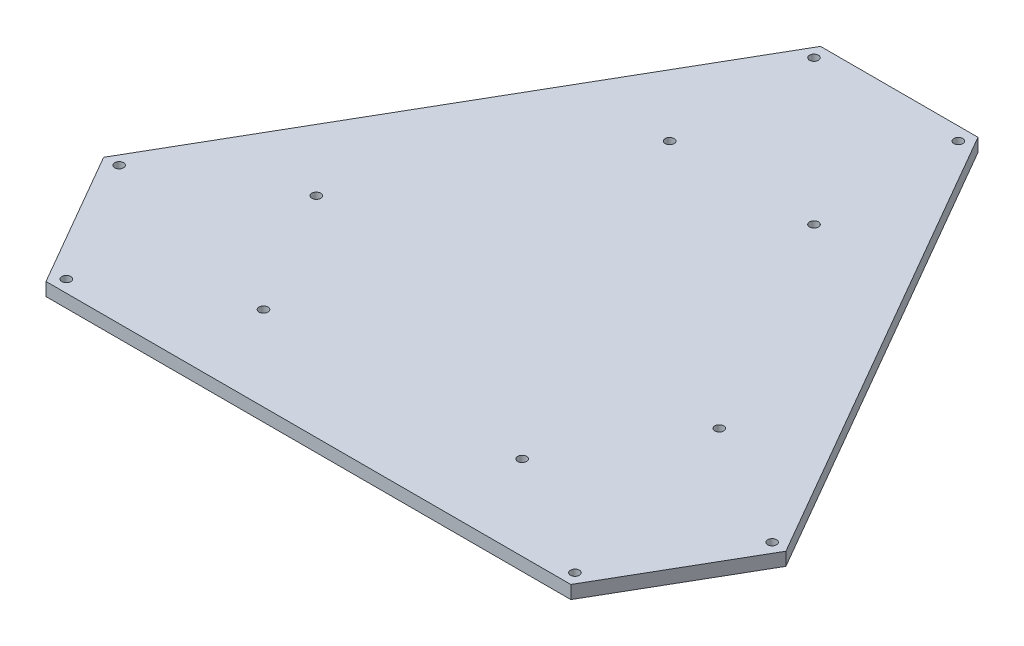
ISO-10303-21;
HEADER;
FILE_DESCRIPTION(('STEP AP214'),'2;1');
FILE_NAME('part.step','',(''),(''),'','','');
FILE_SCHEMA(('AUTOMOTIVE_DESIGN { 1 0 10303 214 1 1 1 1 }'));
ENDSEC;
DATA;
#1=APPLICATION_CONTEXT('core data for automotive mechanical design processes');
#2=APPLICATION_PROTOCOL_DEFINITION('international standard','automotive_design',2000,#1);
#3=PRODUCT_CONTEXT('',#1,'mechanical');
#4=PRODUCT('Part','Part','',(#3));
#5=PRODUCT_RELATED_PRODUCT_CATEGORY('part','',(#4));
#6=PRODUCT_DEFINITION_FORMATION('','',#4);
#7=PRODUCT_DEFINITION_CONTEXT('part definition',#1,'design');
#8=PRODUCT_DEFINITION('design','',#6,#7);
#9=PRODUCT_DEFINITION_SHAPE('','',#8);
#10=(LENGTH_UNIT() NAMED_UNIT(*) SI_UNIT(.MILLI.,.METRE.));
#11=(NAMED_UNIT(*) PLANE_ANGLE_UNIT() SI_UNIT($,.RADIAN.));
#12=(NAMED_UNIT(*) SI_UNIT($,.STERADIAN.) SOLID_ANGLE_UNIT());
#13=UNCERTAINTY_MEASURE_WITH_UNIT(LENGTH_MEASURE(1.E-05),#10,'distance_accuracy_value','');
#14=(GEOMETRIC_REPRESENTATION_CONTEXT(3) GLOBAL_UNCERTAINTY_ASSIGNED_CONTEXT((#13)) GLOBAL_UNIT_ASSIGNED_CONTEXT((#10,
#11,#12)) REPRESENTATION_CONTEXT('',''));
#15=CARTESIAN_POINT('',(0.,0.,0.));
#16=DIRECTION('',(0.,0.,1.));
#17=DIRECTION('',(1.,0.,0.));
#18=AXIS2_PLACEMENT_3D('',#15,#16,#17);
#19=CARTESIAN_POINT('',(0.,5.,0.));
#20=DIRECTION('',(0.,-1.,0.));
#21=DIRECTION('',(0.,0.,-1.));
#22=AXIS2_PLACEMENT_3D('',#19,#20,#21);
#23=PLANE('',#22);
#24=CARTESIAN_POINT('',(-124.419872981078,5.,40.0795823527349));
#25=DIRECTION('',(0.,1.,0.));
#26=DIRECTION('',(0.,0.,-1.));
#27=AXIS2_PLACEMENT_3D('',#24,#25,#26);
#28=CIRCLE('',#27,1.7);
#29=CARTESIAN_POINT('',(-124.419872981078,5.,38.3795823527349));
#30=VERTEX_POINT('',#29);
#31=EDGE_CURVE('E228',#30,#30,#28,.T.);
#32=ORIENTED_EDGE('',*,*,#31,.F.);
#33=EDGE_LOOP('',(#32));
#34=FACE_BOUND('',#33,.T.);
#35=CARTESIAN_POINT('',(-96.9198729810777,5.,87.710979560879));
#36=DIRECTION('',(0.,1.,0.));
#37=DIRECTION('',(0.,0.,1.));
#38=AXIS2_PLACEMENT_3D('',#35,#36,#37);
#39=CIRCLE('',#38,1.7);
#40=CARTESIAN_POINT('',(-96.9198729810777,5.,89.410979560879));
#41=VERTEX_POINT('',#40);
#42=EDGE_CURVE('E242',#41,#41,#39,.T.);
#43=ORIENTED_EDGE('',*,*,#42,.F.);
#44=EDGE_LOOP('',(#43));
#45=FACE_BOUND('',#44,.T.);
#46=CARTESIAN_POINT('',(96.9198729810778,5.,87.710979560879));
#47=DIRECTION('',(0.,1.,0.));
#48=DIRECTION('',(0.,0.,-1.));
#49=AXIS2_PLACEMENT_3D('',#46,#47,#48);
#50=CIRCLE('',#49,1.70000000000001);
#51=CARTESIAN_POINT('',(96.9198729810778,5.,86.010979560879));
#52=VERTEX_POINT('',#51);
#53=EDGE_CURVE('E254',#52,#52,#50,.T.);
#54=ORIENTED_EDGE('',*,*,#53,.F.);
#55=EDGE_LOOP('',(#54));
#56=FACE_BOUND('',#55,.T.);
#57=CARTESIAN_POINT('',(124.419872981078,5.,40.0795823527348));
#58=DIRECTION('',(0.,1.,0.));
#59=DIRECTION('',(0.,0.,1.));
#60=AXIS2_PLACEMENT_3D('',#57,#58,#59);
#61=CIRCLE('',#60,1.7);
#62=CARTESIAN_POINT('',(124.419872981078,5.,41.7795823527348));
#63=VERTEX_POINT('',#62);
#64=EDGE_CURVE('E266',#63,#63,#61,.T.);
#65=ORIENTED_EDGE('',*,*,#64,.F.);
#66=EDGE_LOOP('',(#65));
#67=FACE_BOUND('',#66,.T.);
#68=CARTESIAN_POINT('',(27.5,5.,-127.790561913614));
#69=DIRECTION('',(0.,1.,0.));
#70=DIRECTION('',(0.,0.,-1.));
#71=AXIS2_PLACEMENT_3D('',#68,#69,#70);
#72=CIRCLE('',#71,1.7);
#73=CARTESIAN_POINT('',(27.5,5.,-129.490561913614));
#74=VERTEX_POINT('',#73);
#75=EDGE_CURVE('E278',#74,#74,#72,.T.);
#76=ORIENTED_EDGE('',*,*,#75,.F.);
#77=EDGE_LOOP('',(#76));
#78=FACE_BOUND('',#77,.T.);
#79=CARTESIAN_POINT('',(-27.5,5.,-127.790561913614));
#80=DIRECTION('',(0.,1.,0.));
#81=DIRECTION('',(0.,0.,1.));
#82=AXIS2_PLACEMENT_3D('',#79,#80,#81);
#83=CIRCLE('',#82,1.7);
#84=CARTESIAN_POINT('',(-27.5,5.,-126.090561913614));
#85=VERTEX_POINT('',#84);
#86=EDGE_CURVE('E128',#85,#85,#83,.T.);
#87=ORIENTED_EDGE('',*,*,#86,.F.);
#88=EDGE_LOOP('',(#87));
#89=FACE_BOUND('',#88,.T.);
#90=DIRECTION('',(-0.5,0.,0.866025403784439));
#91=VECTOR('',#90,1.);
#92=CARTESIAN_POINT('',(-130.,5.,40.4145188432739));
#93=LINE('',#92,#91);
#94=CARTESIAN_POINT('',(-30.,5.,-132.790561913614));
#95=VERTEX_POINT('',#94);
#96=CARTESIAN_POINT('',(-130.,5.,40.4145188432739));
#97=VERTEX_POINT('',#96);
#98=EDGE_CURVE('E135',#95,#97,#93,.T.);
#99=ORIENTED_EDGE('',*,*,#98,.T.);
#100=DIRECTION('',(0.5,0.,0.866025403784439));
#101=VECTOR('',#100,1.);
#102=CARTESIAN_POINT('',(-100.,5.,92.3760430703402));
#103=LINE('',#102,#101);
#104=CARTESIAN_POINT('',(-100.,5.,92.3760430703402));
#105=VERTEX_POINT('',#104);
#106=EDGE_CURVE('E93',#97,#105,#103,.T.);
#107=ORIENTED_EDGE('',*,*,#106,.T.);
#108=DIRECTION('',(1.,0.,0.));
#109=VECTOR('',#108,1.);
#110=CARTESIAN_POINT('',(100.,5.,92.3760430703402));
#111=LINE('',#110,#109);
#112=CARTESIAN_POINT('',(100.,5.,92.3760430703402));
#113=VERTEX_POINT('',#112);
#114=EDGE_CURVE('E106',#105,#113,#111,.T.);
#115=ORIENTED_EDGE('',*,*,#114,.T.);
#116=DIRECTION('',(0.5,0.,-0.866025403784439));
#117=VECTOR('',#116,1.);
#118=CARTESIAN_POINT('',(130.,5.,40.4145188432739));
#119=LINE('',#118,#117);
#120=CARTESIAN_POINT('',(130.,5.,40.4145188432739));
#121=VERTEX_POINT('',#120);
#122=EDGE_CURVE('E100',#113,#121,#119,.T.);
#123=ORIENTED_EDGE('',*,*,#122,.T.);
#124=DIRECTION('',(-0.5,0.,-0.866025403784439));
#125=VECTOR('',#124,1.);
#126=CARTESIAN_POINT('',(30.,5.,-132.790561913614));
#127=LINE('',#126,#125);
#128=CARTESIAN_POINT('',(30.,5.,-132.790561913614));
#129=VERTEX_POINT('',#128);
#130=EDGE_CURVE('E104',#121,#129,#127,.T.);
#131=ORIENTED_EDGE('',*,*,#130,.T.);
#132=DIRECTION('',(-1.,0.,0.));
#133=VECTOR('',#132,1.);
#134=CARTESIAN_POINT('',(-30.,5.,-132.790561913614));
#135=LINE('',#134,#133);
#136=EDGE_CURVE('E56',#129,#95,#135,.T.);
#137=ORIENTED_EDGE('',*,*,#136,.T.);
#138=EDGE_LOOP('',(#99,#107,#115,#123,#131,#137));
#139=FACE_BOUND('',#138,.T.);
#140=CARTESIAN_POINT('',(-27.5,5.,-72.7905619136139));
#141=DIRECTION('',(0.,1.,0.));
#142=DIRECTION('',(0.,0.,1.));
#143=AXIS2_PLACEMENT_3D('',#140,#141,#142);
#144=CIRCLE('',#143,1.7);
#145=CARTESIAN_POINT('',(-27.5,5.,-71.0905619136139));
#146=VERTEX_POINT('',#145);
#147=EDGE_CURVE('E284',#146,#146,#144,.T.);
#148=ORIENTED_EDGE('',*,*,#147,.F.);
#149=EDGE_LOOP('',(#148));
#150=FACE_BOUND('',#149,.T.);
#151=CARTESIAN_POINT('',(27.5,5.,-72.7905619136139));
#152=DIRECTION('',(0.,1.,0.));
#153=DIRECTION('',(0.,0.,-1.));
#154=AXIS2_PLACEMENT_3D('',#151,#152,#153);
#155=CIRCLE('',#154,1.7);
#156=CARTESIAN_POINT('',(27.5,5.,-74.4905619136139));
#157=VERTEX_POINT('',#156);
#158=EDGE_CURVE('E272',#157,#157,#155,.T.);
#159=ORIENTED_EDGE('',*,*,#158,.F.);
#160=EDGE_LOOP('',(#159));
#161=FACE_BOUND('',#160,.T.);
#162=CARTESIAN_POINT('',(76.7884757729337,5.,12.5795823527349));
#163=DIRECTION('',(0.,1.,0.));
#164=DIRECTION('',(0.,0.,1.));
#165=AXIS2_PLACEMENT_3D('',#162,#163,#164);
#166=CIRCLE('',#165,1.7);
#167=CARTESIAN_POINT('',(76.7884757729337,5.,14.2795823527349));
#168=VERTEX_POINT('',#167);
#169=EDGE_CURVE('E260',#168,#168,#166,.T.);
#170=ORIENTED_EDGE('',*,*,#169,.F.);
#171=EDGE_LOOP('',(#170));
#172=FACE_BOUND('',#171,.T.);
#173=CARTESIAN_POINT('',(49.2884757729337,5.,60.210979560879));
#174=DIRECTION('',(0.,1.,0.));
#175=DIRECTION('',(0.,0.,-1.));
#176=AXIS2_PLACEMENT_3D('',#173,#174,#175);
#177=CIRCLE('',#176,1.7);
#178=CARTESIAN_POINT('',(49.2884757729337,5.,58.510979560879));
#179=VERTEX_POINT('',#178);
#180=EDGE_CURVE('E248',#179,#179,#177,.T.);
#181=ORIENTED_EDGE('',*,*,#180,.F.);
#182=EDGE_LOOP('',(#181));
#183=FACE_BOUND('',#182,.T.);
#184=CARTESIAN_POINT('',(-49.2884757729336,5.,60.210979560879));
#185=DIRECTION('',(0.,1.,0.));
#186=DIRECTION('',(0.,0.,1.));
#187=AXIS2_PLACEMENT_3D('',#184,#185,#186);
#188=CIRCLE('',#187,1.7);
#189=CARTESIAN_POINT('',(-49.2884757729336,5.,61.910979560879));
#190=VERTEX_POINT('',#189);
#191=EDGE_CURVE('E234',#190,#190,#188,.T.);
#192=ORIENTED_EDGE('',*,*,#191,.F.);
#193=EDGE_LOOP('',(#192));
#194=FACE_BOUND('',#193,.T.);
#195=CARTESIAN_POINT('',(-76.7884757729336,5.,12.5795823527349));
#196=DIRECTION('',(0.,1.,0.));
#197=DIRECTION('',(0.,0.,-1.));
#198=AXIS2_PLACEMENT_3D('',#195,#196,#197);
#199=CIRCLE('',#198,1.70000000000001);
#200=CARTESIAN_POINT('',(-76.7884757729336,5.,10.8795823527349));
#201=VERTEX_POINT('',#200);
#202=EDGE_CURVE('E219',#201,#201,#199,.T.);
#203=ORIENTED_EDGE('',*,*,#202,.F.);
#204=EDGE_LOOP('',(#203));
#205=FACE_BOUND('',#204,.T.);
#206=ADVANCED_FACE('F39',(#34,#45,#56,#67,#78,#89,#139,#150,#161,#172,#183,#194,#205),#23,.F.);
#207=CARTESIAN_POINT('',(0.,0.,0.));
#208=DIRECTION('',(0.,-1.,0.));
#209=DIRECTION('',(0.,0.,-1.));
#210=AXIS2_PLACEMENT_3D('',#207,#208,#209);
#211=PLANE('',#210);
#212=CARTESIAN_POINT('',(-124.419872981078,0.,40.0795823527349));
#213=DIRECTION('',(0.,1.,0.));
#214=DIRECTION('',(0.,0.,-1.));
#215=AXIS2_PLACEMENT_3D('',#212,#213,#214);
#216=CIRCLE('',#215,1.7);
#217=CARTESIAN_POINT('',(-124.419872981078,0.,38.3795823527349));
#218=VERTEX_POINT('',#217);
#219=EDGE_CURVE('E225',#218,#218,#216,.T.);
#220=ORIENTED_EDGE('',*,*,#219,.T.);
#221=EDGE_LOOP('',(#220));
#222=FACE_BOUND('',#221,.T.);
#223=CARTESIAN_POINT('',(-96.9198729810777,0.,87.710979560879));
#224=DIRECTION('',(0.,1.,0.));
#225=DIRECTION('',(0.,0.,1.));
#226=AXIS2_PLACEMENT_3D('',#223,#224,#225);
#227=CIRCLE('',#226,1.7);
#228=CARTESIAN_POINT('',(-96.9198729810777,0.,89.410979560879));
#229=VERTEX_POINT('',#228);
#230=EDGE_CURVE('E238',#229,#229,#227,.T.);
#231=ORIENTED_EDGE('',*,*,#230,.T.);
#232=EDGE_LOOP('',(#231));
#233=FACE_BOUND('',#232,.T.);
#234=CARTESIAN_POINT('',(96.9198729810778,0.,87.710979560879));
#235=DIRECTION('',(0.,1.,0.));
#236=DIRECTION('',(0.,0.,-1.));
#237=AXIS2_PLACEMENT_3D('',#234,#235,#236);
#238=CIRCLE('',#237,1.70000000000001);
#239=CARTESIAN_POINT('',(96.9198729810778,0.,86.010979560879));
#240=VERTEX_POINT('',#239);
#241=EDGE_CURVE('E251',#240,#240,#238,.T.);
#242=ORIENTED_EDGE('',*,*,#241,.T.);
#243=EDGE_LOOP('',(#242));
#244=FACE_BOUND('',#243,.T.);
#245=CARTESIAN_POINT('',(124.419872981078,0.,40.0795823527348));
#246=DIRECTION('',(0.,1.,0.));
#247=DIRECTION('',(0.,0.,1.));
#248=AXIS2_PLACEMENT_3D('',#245,#246,#247);
#249=CIRCLE('',#248,1.7);
#250=CARTESIAN_POINT('',(124.419872981078,0.,41.7795823527348));
#251=VERTEX_POINT('',#250);
#252=EDGE_CURVE('E263',#251,#251,#249,.T.);
#253=ORIENTED_EDGE('',*,*,#252,.T.);
#254=EDGE_LOOP('',(#253));
#255=FACE_BOUND('',#254,.T.);
#256=CARTESIAN_POINT('',(27.5,0.,-127.790561913614));
#257=DIRECTION('',(0.,1.,0.));
#258=DIRECTION('',(0.,0.,-1.));
#259=AXIS2_PLACEMENT_3D('',#256,#257,#258);
#260=CIRCLE('',#259,1.7);
#261=CARTESIAN_POINT('',(27.5,0.,-129.490561913614));
#262=VERTEX_POINT('',#261);
#263=EDGE_CURVE('E275',#262,#262,#260,.T.);
#264=ORIENTED_EDGE('',*,*,#263,.T.);
#265=EDGE_LOOP('',(#264));
#266=FACE_BOUND('',#265,.T.);
#267=CARTESIAN_POINT('',(-27.5,0.,-127.790561913614));
#268=DIRECTION('',(0.,1.,0.));
#269=DIRECTION('',(0.,0.,1.));
#270=AXIS2_PLACEMENT_3D('',#267,#268,#269);
#271=CIRCLE('',#270,1.7);
#272=CARTESIAN_POINT('',(-27.5,0.,-126.090561913614));
#273=VERTEX_POINT('',#272);
#274=EDGE_CURVE('E287',#273,#273,#271,.T.);
#275=ORIENTED_EDGE('',*,*,#274,.T.);
#276=EDGE_LOOP('',(#275));
#277=FACE_BOUND('',#276,.T.);
#278=DIRECTION('',(-0.5,0.,0.866025403784439));
#279=VECTOR('',#278,1.);
#280=CARTESIAN_POINT('',(-130.,0.,40.4145188432739));
#281=LINE('',#280,#279);
#282=CARTESIAN_POINT('',(-30.,0.,-132.790561913614));
#283=VERTEX_POINT('',#282);
#284=CARTESIAN_POINT('',(-130.,0.,40.4145188432739));
#285=VERTEX_POINT('',#284);
#286=EDGE_CURVE('E124',#283,#285,#281,.T.);
#287=ORIENTED_EDGE('',*,*,#286,.F.);
#288=DIRECTION('',(-1.,0.,0.));
#289=VECTOR('',#288,1.);
#290=CARTESIAN_POINT('',(-30.,0.,-132.790561913614));
#291=LINE('',#290,#289);
#292=CARTESIAN_POINT('',(30.,0.,-132.790561913614));
#293=VERTEX_POINT('',#292);
#294=EDGE_CURVE('E85',#293,#283,#291,.T.);
#295=ORIENTED_EDGE('',*,*,#294,.F.);
#296=DIRECTION('',(-0.5,0.,-0.866025403784439));
#297=VECTOR('',#296,1.);
#298=CARTESIAN_POINT('',(30.,0.,-132.790561913614));
#299=LINE('',#298,#297);
#300=CARTESIAN_POINT('',(130.,0.,40.4145188432739));
#301=VERTEX_POINT('',#300);
#302=EDGE_CURVE('E79',#301,#293,#299,.T.);
#303=ORIENTED_EDGE('',*,*,#302,.F.);
#304=DIRECTION('',(0.5,0.,-0.866025403784439));
#305=VECTOR('',#304,1.);
#306=CARTESIAN_POINT('',(130.,0.,40.4145188432739));
#307=LINE('',#306,#305);
#308=CARTESIAN_POINT('',(100.,0.,92.3760430703402));
#309=VERTEX_POINT('',#308);
#310=EDGE_CURVE('E114',#309,#301,#307,.T.);
#311=ORIENTED_EDGE('',*,*,#310,.F.);
#312=DIRECTION('',(1.,0.,0.));
#313=VECTOR('',#312,1.);
#314=CARTESIAN_POINT('',(100.,0.,92.3760430703402));
#315=LINE('',#314,#313);
#316=CARTESIAN_POINT('',(-100.,0.,92.3760430703402));
#317=VERTEX_POINT('',#316);
#318=EDGE_CURVE('E130',#317,#309,#315,.T.);
#319=ORIENTED_EDGE('',*,*,#318,.F.);
#320=DIRECTION('',(0.5,0.,0.866025403784439));
#321=VECTOR('',#320,1.);
#322=CARTESIAN_POINT('',(-100.,0.,92.3760430703402));
#323=LINE('',#322,#321);
#324=EDGE_CURVE('E127',#285,#317,#323,.T.);
#325=ORIENTED_EDGE('',*,*,#324,.F.);
#326=EDGE_LOOP('',(#287,#295,#303,#311,#319,#325));
#327=FACE_BOUND('',#326,.T.);
#328=CARTESIAN_POINT('',(-27.5,0.,-72.7905619136139));
#329=DIRECTION('',(0.,1.,0.));
#330=DIRECTION('',(0.,0.,1.));
#331=AXIS2_PLACEMENT_3D('',#328,#329,#330);
#332=CIRCLE('',#331,1.7);
#333=CARTESIAN_POINT('',(-27.5,0.,-71.0905619136139));
#334=VERTEX_POINT('',#333);
#335=EDGE_CURVE('E281',#334,#334,#332,.T.);
#336=ORIENTED_EDGE('',*,*,#335,.T.);
#337=EDGE_LOOP('',(#336));
#338=FACE_BOUND('',#337,.T.);
#339=CARTESIAN_POINT('',(27.5,0.,-72.7905619136139));
#340=DIRECTION('',(0.,1.,0.));
#341=DIRECTION('',(0.,0.,-1.));
#342=AXIS2_PLACEMENT_3D('',#339,#340,#341);
#343=CIRCLE('',#342,1.7);
#344=CARTESIAN_POINT('',(27.5,0.,-74.4905619136139));
#345=VERTEX_POINT('',#344);
#346=EDGE_CURVE('E269',#345,#345,#343,.T.);
#347=ORIENTED_EDGE('',*,*,#346,.T.);
#348=EDGE_LOOP('',(#347));
#349=FACE_BOUND('',#348,.T.);
#350=CARTESIAN_POINT('',(76.7884757729337,0.,12.5795823527349));
#351=DIRECTION('',(0.,1.,0.));
#352=DIRECTION('',(0.,0.,1.));
#353=AXIS2_PLACEMENT_3D('',#350,#351,#352);
#354=CIRCLE('',#353,1.7);
#355=CARTESIAN_POINT('',(76.7884757729337,0.,14.2795823527349));
#356=VERTEX_POINT('',#355);
#357=EDGE_CURVE('E257',#356,#356,#354,.T.);
#358=ORIENTED_EDGE('',*,*,#357,.T.);
#359=EDGE_LOOP('',(#358));
#360=FACE_BOUND('',#359,.T.);
#361=CARTESIAN_POINT('',(49.2884757729337,0.,60.210979560879));
#362=DIRECTION('',(0.,1.,0.));
#363=DIRECTION('',(0.,0.,-1.));
#364=AXIS2_PLACEMENT_3D('',#361,#362,#363);
#365=CIRCLE('',#364,1.7);
#366=CARTESIAN_POINT('',(49.2884757729337,0.,58.510979560879));
#367=VERTEX_POINT('',#366);
#368=EDGE_CURVE('E245',#367,#367,#365,.T.);
#369=ORIENTED_EDGE('',*,*,#368,.T.);
#370=EDGE_LOOP('',(#369));
#371=FACE_BOUND('',#370,.T.);
#372=CARTESIAN_POINT('',(-49.2884757729336,0.,60.210979560879));
#373=DIRECTION('',(0.,1.,0.));
#374=DIRECTION('',(0.,0.,1.));
#375=AXIS2_PLACEMENT_3D('',#372,#373,#374);
#376=CIRCLE('',#375,1.7);
#377=CARTESIAN_POINT('',(-49.2884757729336,0.,61.910979560879));
#378=VERTEX_POINT('',#377);
#379=EDGE_CURVE('E231',#378,#378,#376,.T.);
#380=ORIENTED_EDGE('',*,*,#379,.T.);
#381=EDGE_LOOP('',(#380));
#382=FACE_BOUND('',#381,.T.);
#383=CARTESIAN_POINT('',(-76.7884757729336,0.,12.5795823527349));
#384=DIRECTION('',(0.,1.,0.));
#385=DIRECTION('',(0.,0.,-1.));
#386=AXIS2_PLACEMENT_3D('',#383,#384,#385);
#387=CIRCLE('',#386,1.70000000000001);
#388=CARTESIAN_POINT('',(-76.7884757729336,0.,10.8795823527349));
#389=VERTEX_POINT('',#388);
#390=EDGE_CURVE('E222',#389,#389,#387,.T.);
#391=ORIENTED_EDGE('',*,*,#390,.T.);
#392=EDGE_LOOP('',(#391));
#393=FACE_BOUND('',#392,.T.);
#394=ADVANCED_FACE('F144',(#222,#233,#244,#255,#266,#277,#327,#338,#349,#360,#371,#382,#393),
#211,.T.);
#395=CARTESIAN_POINT('',(-130.,5.,40.4145188432739));
#396=DIRECTION('',(0.866025403784439,0.,0.5));
#397=DIRECTION('',(0.5,0.,-0.866025403784439));
#398=AXIS2_PLACEMENT_3D('',#395,#396,#397);
#399=PLANE('',#398);
#400=ORIENTED_EDGE('',*,*,#286,.T.);
#401=DIRECTION('',(0.,-1.,0.));
#402=VECTOR('',#401,1.);
#403=CARTESIAN_POINT('',(-130.,5.,40.4145188432739));
#404=LINE('',#403,#402);
#405=EDGE_CURVE('E11',#97,#285,#404,.T.);
#406=ORIENTED_EDGE('',*,*,#405,.F.);
#407=ORIENTED_EDGE('',*,*,#98,.F.);
#408=DIRECTION('',(0.,-1.,0.));
#409=VECTOR('',#408,1.);
#410=CARTESIAN_POINT('',(-30.,5.,-132.790561913614));
#411=LINE('',#410,#409);
#412=EDGE_CURVE('E120',#95,#283,#411,.T.);
#413=ORIENTED_EDGE('',*,*,#412,.T.);
#414=EDGE_LOOP('',(#400,#406,#407,#413));
#415=FACE_BOUND('',#414,.T.);
#416=ADVANCED_FACE('F41',(#415),#399,.F.);
#417=CARTESIAN_POINT('',(-100.,5.,92.3760430703402));
#418=DIRECTION('',(0.866025403784439,0.,-0.5));
#419=DIRECTION('',(-0.5,0.,-0.866025403784439));
#420=AXIS2_PLACEMENT_3D('',#417,#418,#419);
#421=PLANE('',#420);
#422=ORIENTED_EDGE('',*,*,#324,.T.);
#423=DIRECTION('',(0.,-1.,0.));
#424=VECTOR('',#423,1.);
#425=CARTESIAN_POINT('',(-100.,5.,92.3760430703402));
#426=LINE('',#425,#424);
#427=EDGE_CURVE('E48',#105,#317,#426,.T.);
#428=ORIENTED_EDGE('',*,*,#427,.F.);
#429=ORIENTED_EDGE('',*,*,#106,.F.);
#430=ORIENTED_EDGE('',*,*,#405,.T.);
#431=EDGE_LOOP('',(#422,#428,#429,#430));
#432=FACE_BOUND('',#431,.T.);
#433=ADVANCED_FACE('F416',(#432),#421,.F.);
#434=CARTESIAN_POINT('',(100.,5.,92.3760430703402));
#435=DIRECTION('',(0.,0.,-1.));
#436=DIRECTION('',(-1.,0.,0.));
#437=AXIS2_PLACEMENT_3D('',#434,#435,#436);
#438=PLANE('',#437);
#439=ORIENTED_EDGE('',*,*,#318,.T.);
#440=DIRECTION('',(0.,-1.,0.));
#441=VECTOR('',#440,1.);
#442=CARTESIAN_POINT('',(100.,5.,92.3760430703402));
#443=LINE('',#442,#441);
#444=EDGE_CURVE('E115',#113,#309,#443,.T.);
#445=ORIENTED_EDGE('',*,*,#444,.F.);
#446=ORIENTED_EDGE('',*,*,#114,.F.);
#447=ORIENTED_EDGE('',*,*,#427,.T.);
#448=EDGE_LOOP('',(#439,#445,#446,#447));
#449=FACE_BOUND('',#448,.T.);
#450=ADVANCED_FACE('F141',(#449),#438,.F.);
#451=CARTESIAN_POINT('',(130.,5.,40.4145188432739));
#452=DIRECTION('',(-0.866025403784439,0.,-0.5));
#453=DIRECTION('',(-0.5,0.,0.866025403784439));
#454=AXIS2_PLACEMENT_3D('',#451,#452,#453);
#455=PLANE('',#454);
#456=ORIENTED_EDGE('',*,*,#310,.T.);
#457=DIRECTION('',(0.,-1.,0.));
#458=VECTOR('',#457,1.);
#459=CARTESIAN_POINT('',(130.,5.,40.4145188432739));
#460=LINE('',#459,#458);
#461=EDGE_CURVE('E111',#121,#301,#460,.T.);
#462=ORIENTED_EDGE('',*,*,#461,.F.);
#463=ORIENTED_EDGE('',*,*,#122,.F.);
#464=ORIENTED_EDGE('',*,*,#444,.T.);
#465=EDGE_LOOP('',(#456,#462,#463,#464));
#466=FACE_BOUND('',#465,.T.);
#467=ADVANCED_FACE('F112',(#466),#455,.F.);
#468=CARTESIAN_POINT('',(30.,5.,-132.790561913614));
#469=DIRECTION('',(-0.866025403784439,0.,0.5));
#470=DIRECTION('',(0.5,0.,0.866025403784439));
#471=AXIS2_PLACEMENT_3D('',#468,#469,#470);
#472=PLANE('',#471);
#473=ORIENTED_EDGE('',*,*,#302,.T.);
#474=DIRECTION('',(0.,-1.,0.));
#475=VECTOR('',#474,1.);
#476=CARTESIAN_POINT('',(30.,5.,-132.790561913614));
#477=LINE('',#476,#475);
#478=EDGE_CURVE('E116',#129,#293,#477,.T.);
#479=ORIENTED_EDGE('',*,*,#478,.F.);
#480=ORIENTED_EDGE('',*,*,#130,.F.);
#481=ORIENTED_EDGE('',*,*,#461,.T.);
#482=EDGE_LOOP('',(#473,#479,#480,#481));
#483=FACE_BOUND('',#482,.T.);
#484=ADVANCED_FACE('F118',(#483),#472,.F.);
#485=CARTESIAN_POINT('',(-30.,5.,-132.790561913614));
#486=DIRECTION('',(0.,0.,1.));
#487=DIRECTION('',(1.,0.,0.));
#488=AXIS2_PLACEMENT_3D('',#485,#486,#487);
#489=PLANE('',#488);
#490=ORIENTED_EDGE('',*,*,#294,.T.);
#491=ORIENTED_EDGE('',*,*,#412,.F.);
#492=ORIENTED_EDGE('',*,*,#136,.F.);
#493=ORIENTED_EDGE('',*,*,#478,.T.);
#494=EDGE_LOOP('',(#490,#491,#492,#493));
#495=FACE_BOUND('',#494,.T.);
#496=ADVANCED_FACE('F149',(#495),#489,.F.);
#497=CARTESIAN_POINT('',(-27.5,5.,-127.790561913614));
#498=DIRECTION('',(0.,-1.,0.));
#499=DIRECTION('',(0.,0.,-1.));
#500=AXIS2_PLACEMENT_3D('',#497,#498,#499);
#501=CYLINDRICAL_SURFACE('',#500,1.7);
#502=ORIENTED_EDGE('',*,*,#86,.T.);
#503=EDGE_LOOP('',(#502));
#504=FACE_BOUND('',#503,.T.);
#505=ORIENTED_EDGE('',*,*,#274,.F.);
#506=EDGE_LOOP('',(#505));
#507=FACE_BOUND('',#506,.T.);
#508=ADVANCED_FACE('F151',(#504,#507),#501,.F.);
#509=CARTESIAN_POINT('',(-27.5,5.,-72.7905619136139));
#510=DIRECTION('',(0.,-1.,0.));
#511=DIRECTION('',(0.,0.,-1.));
#512=AXIS2_PLACEMENT_3D('',#509,#510,#511);
#513=CYLINDRICAL_SURFACE('',#512,1.7);
#514=ORIENTED_EDGE('',*,*,#147,.T.);
#515=EDGE_LOOP('',(#514));
#516=FACE_BOUND('',#515,.T.);
#517=ORIENTED_EDGE('',*,*,#335,.F.);
#518=EDGE_LOOP('',(#517));
#519=FACE_BOUND('',#518,.T.);
#520=ADVANCED_FACE('F157',(#516,#519),#513,.F.);
#521=CARTESIAN_POINT('',(27.5,5.,-127.790561913614));
#522=DIRECTION('',(0.,-1.,0.));
#523=DIRECTION('',(0.,0.,-1.));
#524=AXIS2_PLACEMENT_3D('',#521,#522,#523);
#525=CYLINDRICAL_SURFACE('',#524,1.7);
#526=ORIENTED_EDGE('',*,*,#75,.T.);
#527=EDGE_LOOP('',(#526));
#528=FACE_BOUND('',#527,.T.);
#529=ORIENTED_EDGE('',*,*,#263,.F.);
#530=EDGE_LOOP('',(#529));
#531=FACE_BOUND('',#530,.T.);
#532=ADVANCED_FACE('F174',(#528,#531),#525,.F.);
#533=CARTESIAN_POINT('',(27.5,5.,-72.7905619136139));
#534=DIRECTION('',(0.,-1.,0.));
#535=DIRECTION('',(0.,0.,-1.));
#536=AXIS2_PLACEMENT_3D('',#533,#534,#535);
#537=CYLINDRICAL_SURFACE('',#536,1.7);
#538=ORIENTED_EDGE('',*,*,#158,.T.);
#539=EDGE_LOOP('',(#538));
#540=FACE_BOUND('',#539,.T.);
#541=ORIENTED_EDGE('',*,*,#346,.F.);
#542=EDGE_LOOP('',(#541));
#543=FACE_BOUND('',#542,.T.);
#544=ADVANCED_FACE('F178',(#540,#543),#537,.F.);
#545=CARTESIAN_POINT('',(124.419872981078,5.,40.0795823527348));
#546=DIRECTION('',(0.,-1.,0.));
#547=DIRECTION('',(0.,0.,-1.));
#548=AXIS2_PLACEMENT_3D('',#545,#546,#547);
#549=CYLINDRICAL_SURFACE('',#548,1.7);
#550=ORIENTED_EDGE('',*,*,#64,.T.);
#551=EDGE_LOOP('',(#550));
#552=FACE_BOUND('',#551,.T.);
#553=ORIENTED_EDGE('',*,*,#252,.F.);
#554=EDGE_LOOP('',(#553));
#555=FACE_BOUND('',#554,.T.);
#556=ADVANCED_FACE('F182',(#552,#555),#549,.F.);
#557=CARTESIAN_POINT('',(76.7884757729337,5.,12.5795823527349));
#558=DIRECTION('',(0.,-1.,0.));
#559=DIRECTION('',(0.,0.,-1.));
#560=AXIS2_PLACEMENT_3D('',#557,#558,#559);
#561=CYLINDRICAL_SURFACE('',#560,1.7);
#562=ORIENTED_EDGE('',*,*,#169,.T.);
#563=EDGE_LOOP('',(#562));
#564=FACE_BOUND('',#563,.T.);
#565=ORIENTED_EDGE('',*,*,#357,.F.);
#566=EDGE_LOOP('',(#565));
#567=FACE_BOUND('',#566,.T.);
#568=ADVANCED_FACE('F186',(#564,#567),#561,.F.);
#569=CARTESIAN_POINT('',(96.9198729810778,5.,87.710979560879));
#570=DIRECTION('',(0.,-1.,0.));
#571=DIRECTION('',(0.,0.,-1.));
#572=AXIS2_PLACEMENT_3D('',#569,#570,#571);
#573=CYLINDRICAL_SURFACE('',#572,1.70000000000001);
#574=ORIENTED_EDGE('',*,*,#53,.T.);
#575=EDGE_LOOP('',(#574));
#576=FACE_BOUND('',#575,.T.);
#577=ORIENTED_EDGE('',*,*,#241,.F.);
#578=EDGE_LOOP('',(#577));
#579=FACE_BOUND('',#578,.T.);
#580=ADVANCED_FACE('F190',(#576,#579),#573,.F.);
#581=CARTESIAN_POINT('',(49.2884757729337,5.,60.210979560879));
#582=DIRECTION('',(0.,-1.,0.));
#583=DIRECTION('',(0.,0.,-1.));
#584=AXIS2_PLACEMENT_3D('',#581,#582,#583);
#585=CYLINDRICAL_SURFACE('',#584,1.7);
#586=ORIENTED_EDGE('',*,*,#180,.T.);
#587=EDGE_LOOP('',(#586));
#588=FACE_BOUND('',#587,.T.);
#589=ORIENTED_EDGE('',*,*,#368,.F.);
#590=EDGE_LOOP('',(#589));
#591=FACE_BOUND('',#590,.T.);
#592=ADVANCED_FACE('F194',(#588,#591),#585,.F.);
#593=CARTESIAN_POINT('',(-96.9198729810777,5.,87.710979560879));
#594=DIRECTION('',(0.,-1.,0.));
#595=DIRECTION('',(0.,0.,-1.));
#596=AXIS2_PLACEMENT_3D('',#593,#594,#595);
#597=CYLINDRICAL_SURFACE('',#596,1.7);
#598=ORIENTED_EDGE('',*,*,#42,.T.);
#599=EDGE_LOOP('',(#598));
#600=FACE_BOUND('',#599,.T.);
#601=ORIENTED_EDGE('',*,*,#230,.F.);
#602=EDGE_LOOP('',(#601));
#603=FACE_BOUND('',#602,.T.);
#604=ADVANCED_FACE('F198',(#600,#603),#597,.F.);
#605=CARTESIAN_POINT('',(-49.2884757729336,5.,60.210979560879));
#606=DIRECTION('',(0.,-1.,0.));
#607=DIRECTION('',(0.,0.,-1.));
#608=AXIS2_PLACEMENT_3D('',#605,#606,#607);
#609=CYLINDRICAL_SURFACE('',#608,1.7);
#610=ORIENTED_EDGE('',*,*,#191,.T.);
#611=EDGE_LOOP('',(#610));
#612=FACE_BOUND('',#611,.T.);
#613=ORIENTED_EDGE('',*,*,#379,.F.);
#614=EDGE_LOOP('',(#613));
#615=FACE_BOUND('',#614,.T.);
#616=ADVANCED_FACE('F202',(#612,#615),#609,.F.);
#617=CARTESIAN_POINT('',(-124.419872981078,5.,40.0795823527349));
#618=DIRECTION('',(0.,-1.,0.));
#619=DIRECTION('',(0.,0.,-1.));
#620=AXIS2_PLACEMENT_3D('',#617,#618,#619);
#621=CYLINDRICAL_SURFACE('',#620,1.7);
#622=ORIENTED_EDGE('',*,*,#31,.T.);
#623=EDGE_LOOP('',(#622));
#624=FACE_BOUND('',#623,.T.);
#625=ORIENTED_EDGE('',*,*,#219,.F.);
#626=EDGE_LOOP('',(#625));
#627=FACE_BOUND('',#626,.T.);
#628=ADVANCED_FACE('F206',(#624,#627),#621,.F.);
#629=CARTESIAN_POINT('',(-76.7884757729336,5.,12.5795823527349));
#630=DIRECTION('',(0.,-1.,0.));
#631=DIRECTION('',(0.,0.,-1.));
#632=AXIS2_PLACEMENT_3D('',#629,#630,#631);
#633=CYLINDRICAL_SURFACE('',#632,1.70000000000001);
#634=ORIENTED_EDGE('',*,*,#202,.T.);
#635=EDGE_LOOP('',(#634));
#636=FACE_BOUND('',#635,.T.);
#637=ORIENTED_EDGE('',*,*,#390,.F.);
#638=EDGE_LOOP('',(#637));
#639=FACE_BOUND('',#638,.T.);
#640=ADVANCED_FACE('F210',(#636,#639),#633,.F.);
#641=CLOSED_SHELL('',(#206,#394,#416,#433,#450,#467,#484,#496,#508,#520,#532,#544,#556,#568,
#580,#592,#604,#616,#628,#640));
#642=MANIFOLD_SOLID_BREP('B2',#641);
#643=ADVANCED_BREP_SHAPE_REPRESENTATION('',(#18,#642),#14);
#644=SHAPE_DEFINITION_REPRESENTATION(#9,#643);
ENDSEC;
END-ISO-10303-21;
